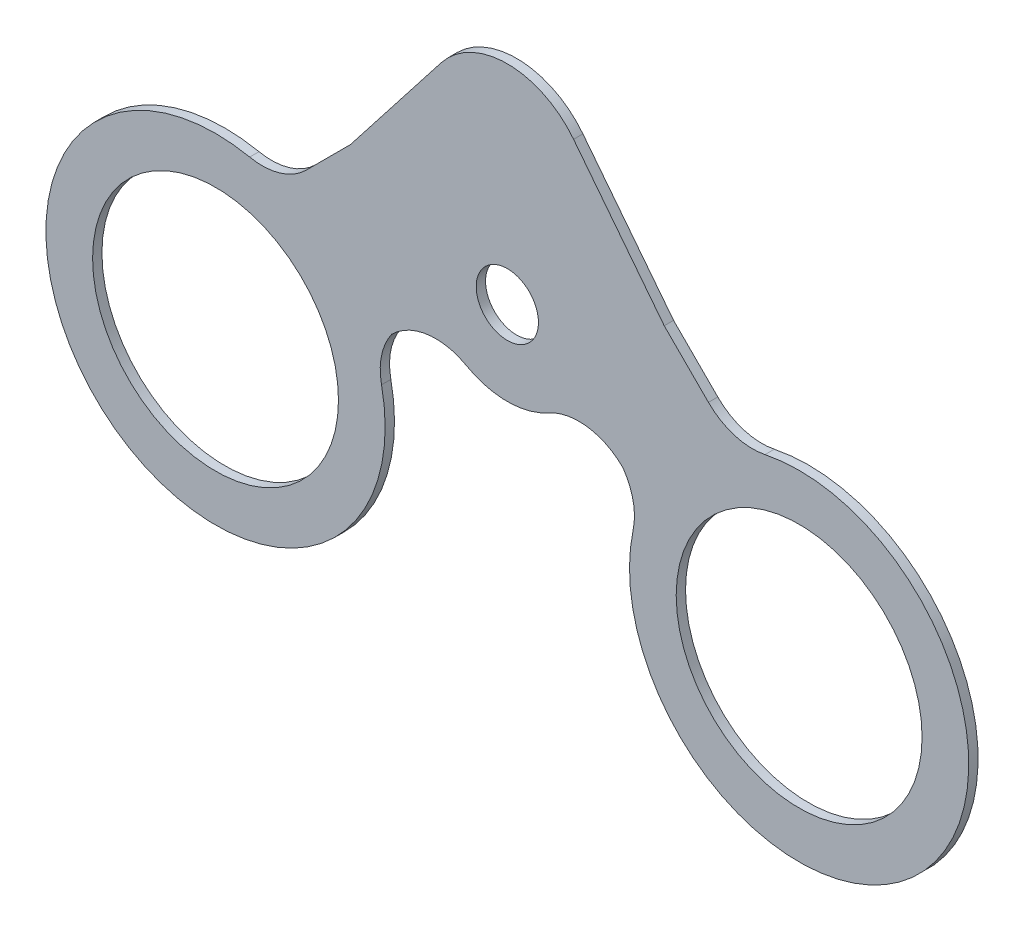
ISO-10303-21;
HEADER;
FILE_DESCRIPTION(('STEP AP214'),'2;1');
FILE_NAME('part.step','',(''),(''),'','','');
FILE_SCHEMA(('AUTOMOTIVE_DESIGN { 1 0 10303 214 1 1 1 1 }'));
ENDSEC;
DATA;
#1=APPLICATION_CONTEXT('core data for automotive mechanical design processes');
#2=APPLICATION_PROTOCOL_DEFINITION('international standard','automotive_design',2000,#1);
#3=PRODUCT_CONTEXT('',#1,'mechanical');
#4=PRODUCT('Part','Part','',(#3));
#5=PRODUCT_RELATED_PRODUCT_CATEGORY('part','',(#4));
#6=PRODUCT_DEFINITION_FORMATION('','',#4);
#7=PRODUCT_DEFINITION_CONTEXT('part definition',#1,'design');
#8=PRODUCT_DEFINITION('design','',#6,#7);
#9=PRODUCT_DEFINITION_SHAPE('','',#8);
#10=(LENGTH_UNIT() NAMED_UNIT(*) SI_UNIT(.MILLI.,.METRE.));
#11=(NAMED_UNIT(*) PLANE_ANGLE_UNIT() SI_UNIT($,.RADIAN.));
#12=(NAMED_UNIT(*) SI_UNIT($,.STERADIAN.) SOLID_ANGLE_UNIT());
#13=UNCERTAINTY_MEASURE_WITH_UNIT(LENGTH_MEASURE(1.E-05),#10,'distance_accuracy_value','');
#14=(GEOMETRIC_REPRESENTATION_CONTEXT(3) GLOBAL_UNCERTAINTY_ASSIGNED_CONTEXT((#13)) GLOBAL_UNIT_ASSIGNED_CONTEXT((#10,
#11,#12)) REPRESENTATION_CONTEXT('',''));
#15=CARTESIAN_POINT('',(0.,0.,0.));
#16=DIRECTION('',(0.,0.,1.));
#17=DIRECTION('',(1.,0.,0.));
#18=AXIS2_PLACEMENT_3D('',#15,#16,#17);
#19=CARTESIAN_POINT('',(-93.75,0.,3.));
#20=DIRECTION('',(0.,0.,1.));
#21=DIRECTION('',(1.,0.,0.));
#22=AXIS2_PLACEMENT_3D('',#19,#20,#21);
#23=PLANE('',#22);
#24=CARTESIAN_POINT('',(-93.75,0.,3.));
#25=DIRECTION('',(0.,0.,1.));
#26=DIRECTION('',(1.,0.,0.));
#27=AXIS2_PLACEMENT_3D('',#24,#25,#26);
#28=CIRCLE('',#27,39.5);
#29=CARTESIAN_POINT('',(-54.25,0.,3.));
#30=VERTEX_POINT('',#29);
#31=EDGE_CURVE('E282',#30,#30,#28,.T.);
#32=ORIENTED_EDGE('',*,*,#31,.F.);
#33=EDGE_LOOP('',(#32));
#34=FACE_BOUND('',#33,.T.);
#35=DIRECTION('',(-0.707106781186548,-0.707106781186547,0.));
#36=VECTOR('',#35,1.);
#37=CARTESIAN_POINT('',(-73.038609063629,50.4111920656595,3.));
#38=LINE('',#37,#36);
#39=CARTESIAN_POINT('',(-50.4111920656595,73.038609063629,3.));
#40=VERTEX_POINT('',#39);
#41=CARTESIAN_POINT('',(-64.6159621592224,58.8338389700661,3.));
#42=VERTEX_POINT('',#41);
#43=EDGE_CURVE('E170',#40,#42,#38,.T.);
#44=ORIENTED_EDGE('',*,*,#43,.T.);
#45=CARTESIAN_POINT('',(-78.7580977829533,72.975974593797,3.));
#46=DIRECTION('',(0.,0.,1.));
#47=DIRECTION('',(1.,0.,0.));
#48=AXIS2_PLACEMENT_3D('',#45,#46,#47);
#49=CIRCLE('',#48,20.);
#50=CARTESIAN_POINT('',(-82.7827695190733,53.3851089310327,3.));
#51=VERTEX_POINT('',#50);
#52=EDGE_CURVE('E235',#42,#51,#49,.F.);
#53=ORIENTED_EDGE('',*,*,#52,.T.);
#54=CARTESIAN_POINT('',(-93.75,0.,3.));
#55=DIRECTION('',(0.,0.,1.));
#56=DIRECTION('',(1.,0.,0.));
#57=AXIS2_PLACEMENT_3D('',#54,#55,#56);
#58=CIRCLE('',#57,54.5);
#59=CARTESIAN_POINT('',(-40.4147300473612,11.2070950330203,3.));
#60=VERTEX_POINT('',#59);
#61=EDGE_CURVE('E192',#51,#60,#58,.T.);
#62=ORIENTED_EDGE('',*,*,#61,.T.);
#63=CARTESIAN_POINT('',(-20.8421539179525,15.3197904579819,3.));
#64=DIRECTION('',(0.,0.,1.));
#65=DIRECTION('',(1.,0.,0.));
#66=AXIS2_PLACEMENT_3D('',#63,#64,#65);
#67=CIRCLE('',#66,20.);
#68=CARTESIAN_POINT('',(-37.1445252809144,26.9056735897971,3.));
#69=VERTEX_POINT('',#68);
#70=EDGE_CURVE('E11',#60,#69,#67,.F.);
#71=ORIENTED_EDGE('',*,*,#70,.T.);
#72=CARTESIAN_POINT('',(-23.0023896571834,12.7635379660662,3.));
#73=DIRECTION('',(0.,0.,1.));
#74=DIRECTION('',(1.,0.,0.));
#75=AXIS2_PLACEMENT_3D('',#72,#73,#74);
#76=CIRCLE('',#75,20.);
#77=CARTESIAN_POINT('',(-13.214138739233,30.2045856400806,3.));
#78=VERTEX_POINT('',#77);
#79=EDGE_CURVE('E216',#69,#78,#76,.F.);
#80=ORIENTED_EDGE('',*,*,#79,.T.);
#81=CARTESIAN_POINT('',(0.,53.75,3.));
#82=DIRECTION('',(0.,0.,1.));
#83=DIRECTION('',(1.,0.,0.));
#84=AXIS2_PLACEMENT_3D('',#81,#82,#83);
#85=CIRCLE('',#84,27.);
#86=CARTESIAN_POINT('',(13.214138739233,30.2045856400806,3.));
#87=VERTEX_POINT('',#86);
#88=EDGE_CURVE('E261',#78,#87,#85,.T.);
#89=ORIENTED_EDGE('',*,*,#88,.T.);
#90=CARTESIAN_POINT('',(23.0023896571834,12.7635379660661,3.));
#91=DIRECTION('',(0.,0.,1.));
#92=DIRECTION('',(1.,0.,0.));
#93=AXIS2_PLACEMENT_3D('',#90,#91,#92);
#94=CIRCLE('',#93,20.);
#95=CARTESIAN_POINT('',(37.1445252809143,26.9056735897971,3.));
#96=VERTEX_POINT('',#95);
#97=EDGE_CURVE('E211',#87,#96,#94,.F.);
#98=ORIENTED_EDGE('',*,*,#97,.T.);
#99=CARTESIAN_POINT('',(20.8421539179525,15.3197904579818,3.));
#100=DIRECTION('',(0.,0.,1.));
#101=DIRECTION('',(1.,0.,0.));
#102=AXIS2_PLACEMENT_3D('',#99,#100,#101);
#103=CIRCLE('',#102,20.);
#104=CARTESIAN_POINT('',(40.4147300473612,11.2070950330202,3.));
#105=VERTEX_POINT('',#104);
#106=EDGE_CURVE('E239',#96,#105,#103,.F.);
#107=ORIENTED_EDGE('',*,*,#106,.T.);
#108=CARTESIAN_POINT('',(93.75,0.,3.));
#109=DIRECTION('',(0.,0.,1.));
#110=DIRECTION('',(1.,0.,0.));
#111=AXIS2_PLACEMENT_3D('',#108,#109,#110);
#112=CIRCLE('',#111,54.5);
#113=CARTESIAN_POINT('',(82.7827695190733,53.3851089310328,3.));
#114=VERTEX_POINT('',#113);
#115=EDGE_CURVE('E148',#105,#114,#112,.T.);
#116=ORIENTED_EDGE('',*,*,#115,.T.);
#117=CARTESIAN_POINT('',(78.7580977829534,72.9759745937971,3.));
#118=DIRECTION('',(0.,0.,1.));
#119=DIRECTION('',(1.,0.,0.));
#120=AXIS2_PLACEMENT_3D('',#117,#118,#119);
#121=CIRCLE('',#120,20.);
#122=CARTESIAN_POINT('',(64.6159621592224,58.8338389700661,3.));
#123=VERTEX_POINT('',#122);
#124=EDGE_CURVE('E144',#114,#123,#121,.F.);
#125=ORIENTED_EDGE('',*,*,#124,.T.);
#126=DIRECTION('',(-0.707106781186548,0.707106781186547,0.));
#127=VECTOR('',#126,1.);
#128=CARTESIAN_POINT('',(73.038609063629,50.4111920656595,3.));
#129=LINE('',#128,#127);
#130=CARTESIAN_POINT('',(50.4111920656595,73.038609063629,3.));
#131=VERTEX_POINT('',#130);
#132=EDGE_CURVE('E136',#123,#131,#129,.T.);
#133=ORIENTED_EDGE('',*,*,#132,.T.);
#134=DIRECTION('',(-0.615217955531509,0.788357068333652,0.));
#135=VECTOR('',#134,1.);
#136=CARTESIAN_POINT('',(50.4111920656595,73.038609063629,3.));
#137=LINE('',#136,#135);
#138=CARTESIAN_POINT('',(21.2856408450086,110.360884799351,3.));
#139=VERTEX_POINT('',#138);
#140=EDGE_CURVE('E140',#131,#139,#137,.T.);
#141=ORIENTED_EDGE('',*,*,#140,.T.);
#142=CARTESIAN_POINT('',(0.,93.75,3.));
#143=DIRECTION('',(0.,0.,1.));
#144=DIRECTION('',(1.,0.,0.));
#145=AXIS2_PLACEMENT_3D('',#142,#143,#144);
#146=CIRCLE('',#145,27.);
#147=CARTESIAN_POINT('',(-21.2856408450086,110.360884799351,3.));
#148=VERTEX_POINT('',#147);
#149=EDGE_CURVE('E163',#139,#148,#146,.T.);
#150=ORIENTED_EDGE('',*,*,#149,.T.);
#151=DIRECTION('',(-0.615217955531509,-0.788357068333652,0.));
#152=VECTOR('',#151,1.);
#153=CARTESIAN_POINT('',(-50.4111920656595,73.038609063629,3.));
#154=LINE('',#153,#152);
#155=EDGE_CURVE('E165',#148,#40,#154,.T.);
#156=ORIENTED_EDGE('',*,*,#155,.T.);
#157=EDGE_LOOP('',(#44,#53,#62,#71,#80,#89,#98,#107,#116,#125,#133,#141,#150,#156));
#158=FACE_BOUND('',#157,.T.);
#159=CARTESIAN_POINT('',(93.75,0.,3.));
#160=DIRECTION('',(0.,0.,1.));
#161=DIRECTION('',(1.,0.,0.));
#162=AXIS2_PLACEMENT_3D('',#159,#160,#161);
#163=CIRCLE('',#162,39.5);
#164=CARTESIAN_POINT('',(133.25,0.,3.));
#165=VERTEX_POINT('',#164);
#166=EDGE_CURVE('E177',#165,#165,#163,.T.);
#167=ORIENTED_EDGE('',*,*,#166,.F.);
#168=EDGE_LOOP('',(#167));
#169=FACE_BOUND('',#168,.T.);
#170=CARTESIAN_POINT('',(0.,53.75,3.));
#171=DIRECTION('',(0.,0.,1.));
#172=DIRECTION('',(1.,0.,0.));
#173=AXIS2_PLACEMENT_3D('',#170,#171,#172);
#174=CIRCLE('',#173,10.);
#175=CARTESIAN_POINT('',(10.,53.75,3.));
#176=VERTEX_POINT('',#175);
#177=EDGE_CURVE('E288',#176,#176,#174,.T.);
#178=ORIENTED_EDGE('',*,*,#177,.F.);
#179=EDGE_LOOP('',(#178));
#180=FACE_BOUND('',#179,.T.);
#181=ADVANCED_FACE('F35',(#34,#158,#169,#180),#23,.T.);
#182=CARTESIAN_POINT('',(-93.75,0.,0.));
#183=DIRECTION('',(0.,0.,1.));
#184=DIRECTION('',(1.,0.,0.));
#185=AXIS2_PLACEMENT_3D('',#182,#183,#184);
#186=PLANE('',#185);
#187=CARTESIAN_POINT('',(-93.75,0.,0.));
#188=DIRECTION('',(0.,0.,1.));
#189=DIRECTION('',(1.,0.,0.));
#190=AXIS2_PLACEMENT_3D('',#187,#188,#189);
#191=CIRCLE('',#190,54.5);
#192=CARTESIAN_POINT('',(-82.7827695190733,53.3851089310327,0.));
#193=VERTEX_POINT('',#192);
#194=CARTESIAN_POINT('',(-40.4147300473612,11.2070950330203,0.));
#195=VERTEX_POINT('',#194);
#196=EDGE_CURVE('E173',#193,#195,#191,.T.);
#197=ORIENTED_EDGE('',*,*,#196,.F.);
#198=CARTESIAN_POINT('',(-78.7580977829533,72.975974593797,0.));
#199=DIRECTION('',(0.,0.,1.));
#200=DIRECTION('',(1.,0.,0.));
#201=AXIS2_PLACEMENT_3D('',#198,#199,#200);
#202=CIRCLE('',#201,20.);
#203=CARTESIAN_POINT('',(-64.6159621592224,58.8338389700661,0.));
#204=VERTEX_POINT('',#203);
#205=EDGE_CURVE('E58',#193,#204,#202,.T.);
#206=ORIENTED_EDGE('',*,*,#205,.T.);
#207=DIRECTION('',(-0.707106781186548,-0.707106781186547,0.));
#208=VECTOR('',#207,1.);
#209=CARTESIAN_POINT('',(-73.038609063629,50.4111920656595,0.));
#210=LINE('',#209,#208);
#211=CARTESIAN_POINT('',(-50.4111920656595,73.038609063629,0.));
#212=VERTEX_POINT('',#211);
#213=EDGE_CURVE('E190',#212,#204,#210,.T.);
#214=ORIENTED_EDGE('',*,*,#213,.F.);
#215=DIRECTION('',(-0.615217955531509,-0.788357068333652,0.));
#216=VECTOR('',#215,1.);
#217=CARTESIAN_POINT('',(-50.4111920656595,73.038609063629,0.));
#218=LINE('',#217,#216);
#219=CARTESIAN_POINT('',(-21.2856408450086,110.360884799351,0.));
#220=VERTEX_POINT('',#219);
#221=EDGE_CURVE('E188',#220,#212,#218,.T.);
#222=ORIENTED_EDGE('',*,*,#221,.F.);
#223=CARTESIAN_POINT('',(0.,93.75,0.));
#224=DIRECTION('',(0.,0.,1.));
#225=DIRECTION('',(1.,0.,0.));
#226=AXIS2_PLACEMENT_3D('',#223,#224,#225);
#227=CIRCLE('',#226,27.);
#228=CARTESIAN_POINT('',(21.2856408450086,110.360884799351,0.));
#229=VERTEX_POINT('',#228);
#230=EDGE_CURVE('E186',#229,#220,#227,.T.);
#231=ORIENTED_EDGE('',*,*,#230,.F.);
#232=DIRECTION('',(-0.615217955531509,0.788357068333652,0.));
#233=VECTOR('',#232,1.);
#234=CARTESIAN_POINT('',(50.4111920656595,73.038609063629,0.));
#235=LINE('',#234,#233);
#236=CARTESIAN_POINT('',(50.4111920656595,73.038609063629,0.));
#237=VERTEX_POINT('',#236);
#238=EDGE_CURVE('E184',#237,#229,#235,.T.);
#239=ORIENTED_EDGE('',*,*,#238,.F.);
#240=DIRECTION('',(-0.707106781186548,0.707106781186547,0.));
#241=VECTOR('',#240,1.);
#242=CARTESIAN_POINT('',(73.038609063629,50.4111920656595,0.));
#243=LINE('',#242,#241);
#244=CARTESIAN_POINT('',(64.6159621592224,58.8338389700661,0.));
#245=VERTEX_POINT('',#244);
#246=EDGE_CURVE('E154',#245,#237,#243,.T.);
#247=ORIENTED_EDGE('',*,*,#246,.F.);
#248=CARTESIAN_POINT('',(78.7580977829534,72.9759745937971,0.));
#249=DIRECTION('',(0.,0.,1.));
#250=DIRECTION('',(1.,0.,0.));
#251=AXIS2_PLACEMENT_3D('',#248,#249,#250);
#252=CIRCLE('',#251,20.);
#253=CARTESIAN_POINT('',(82.7827695190733,53.3851089310328,0.));
#254=VERTEX_POINT('',#253);
#255=EDGE_CURVE('E231',#245,#254,#252,.T.);
#256=ORIENTED_EDGE('',*,*,#255,.T.);
#257=CARTESIAN_POINT('',(93.75,0.,0.));
#258=DIRECTION('',(0.,0.,1.));
#259=DIRECTION('',(1.,0.,0.));
#260=AXIS2_PLACEMENT_3D('',#257,#258,#259);
#261=CIRCLE('',#260,54.5);
#262=CARTESIAN_POINT('',(40.4147300473612,11.2070950330202,0.));
#263=VERTEX_POINT('',#262);
#264=EDGE_CURVE('E180',#263,#254,#261,.T.);
#265=ORIENTED_EDGE('',*,*,#264,.F.);
#266=CARTESIAN_POINT('',(20.8421539179525,15.3197904579818,0.));
#267=DIRECTION('',(0.,0.,1.));
#268=DIRECTION('',(1.,0.,0.));
#269=AXIS2_PLACEMENT_3D('',#266,#267,#268);
#270=CIRCLE('',#269,20.);
#271=CARTESIAN_POINT('',(37.1445252809143,26.9056735897971,0.));
#272=VERTEX_POINT('',#271);
#273=EDGE_CURVE('E237',#263,#272,#270,.T.);
#274=ORIENTED_EDGE('',*,*,#273,.T.);
#275=CARTESIAN_POINT('',(23.0023896571834,12.7635379660661,0.));
#276=DIRECTION('',(0.,0.,1.));
#277=DIRECTION('',(1.,0.,0.));
#278=AXIS2_PLACEMENT_3D('',#275,#276,#277);
#279=CIRCLE('',#278,20.);
#280=CARTESIAN_POINT('',(13.214138739233,30.2045856400806,0.));
#281=VERTEX_POINT('',#280);
#282=EDGE_CURVE('E209',#272,#281,#279,.T.);
#283=ORIENTED_EDGE('',*,*,#282,.T.);
#284=CARTESIAN_POINT('',(0.,53.75,0.));
#285=DIRECTION('',(0.,0.,1.));
#286=DIRECTION('',(1.,0.,0.));
#287=AXIS2_PLACEMENT_3D('',#284,#285,#286);
#288=CIRCLE('',#287,27.);
#289=CARTESIAN_POINT('',(-13.214138739233,30.2045856400806,0.));
#290=VERTEX_POINT('',#289);
#291=EDGE_CURVE('E176',#290,#281,#288,.T.);
#292=ORIENTED_EDGE('',*,*,#291,.F.);
#293=CARTESIAN_POINT('',(-23.0023896571834,12.7635379660662,0.));
#294=DIRECTION('',(0.,0.,1.));
#295=DIRECTION('',(1.,0.,0.));
#296=AXIS2_PLACEMENT_3D('',#293,#294,#295);
#297=CIRCLE('',#296,20.);
#298=CARTESIAN_POINT('',(-37.1445252809144,26.9056735897971,0.));
#299=VERTEX_POINT('',#298);
#300=EDGE_CURVE('E213',#290,#299,#297,.T.);
#301=ORIENTED_EDGE('',*,*,#300,.T.);
#302=CARTESIAN_POINT('',(-20.8421539179525,15.3197904579819,0.));
#303=DIRECTION('',(0.,0.,1.));
#304=DIRECTION('',(1.,0.,0.));
#305=AXIS2_PLACEMENT_3D('',#302,#303,#304);
#306=CIRCLE('',#305,20.);
#307=EDGE_CURVE('E43',#299,#195,#306,.T.);
#308=ORIENTED_EDGE('',*,*,#307,.T.);
#309=EDGE_LOOP('',(#197,#206,#214,#222,#231,#239,#247,#256,#265,#274,#283,#292,#301,#308));
#310=FACE_BOUND('',#309,.T.);
#311=CARTESIAN_POINT('',(93.75,0.,0.));
#312=DIRECTION('',(0.,0.,1.));
#313=DIRECTION('',(1.,0.,0.));
#314=AXIS2_PLACEMENT_3D('',#311,#312,#313);
#315=CIRCLE('',#314,39.5);
#316=CARTESIAN_POINT('',(133.25,0.,0.));
#317=VERTEX_POINT('',#316);
#318=EDGE_CURVE('E279',#317,#317,#315,.T.);
#319=ORIENTED_EDGE('',*,*,#318,.T.);
#320=EDGE_LOOP('',(#319));
#321=FACE_BOUND('',#320,.T.);
#322=CARTESIAN_POINT('',(-93.75,0.,0.));
#323=DIRECTION('',(0.,0.,1.));
#324=DIRECTION('',(1.,0.,0.));
#325=AXIS2_PLACEMENT_3D('',#322,#323,#324);
#326=CIRCLE('',#325,39.5);
#327=CARTESIAN_POINT('',(-54.25,0.,0.));
#328=VERTEX_POINT('',#327);
#329=EDGE_CURVE('E285',#328,#328,#326,.T.);
#330=ORIENTED_EDGE('',*,*,#329,.T.);
#331=EDGE_LOOP('',(#330));
#332=FACE_BOUND('',#331,.T.);
#333=CARTESIAN_POINT('',(0.,53.75,0.));
#334=DIRECTION('',(0.,0.,1.));
#335=DIRECTION('',(1.,0.,0.));
#336=AXIS2_PLACEMENT_3D('',#333,#334,#335);
#337=CIRCLE('',#336,10.);
#338=CARTESIAN_POINT('',(10.,53.75,0.));
#339=VERTEX_POINT('',#338);
#340=EDGE_CURVE('E291',#339,#339,#337,.T.);
#341=ORIENTED_EDGE('',*,*,#340,.T.);
#342=EDGE_LOOP('',(#341));
#343=FACE_BOUND('',#342,.T.);
#344=ADVANCED_FACE('F240',(#310,#321,#332,#343),#186,.F.);
#345=CARTESIAN_POINT('',(-93.75,0.,3.));
#346=DIRECTION('',(0.,0.,-1.));
#347=DIRECTION('',(-1.,0.,0.));
#348=AXIS2_PLACEMENT_3D('',#345,#346,#347);
#349=CYLINDRICAL_SURFACE('',#348,54.5);
#350=ORIENTED_EDGE('',*,*,#61,.F.);
#351=DIRECTION('',(0.,0.,-1.));
#352=VECTOR('',#351,1.);
#353=CARTESIAN_POINT('',(-82.7827695190733,53.3851089310328,3.));
#354=LINE('',#353,#352);
#355=EDGE_CURVE('E227',#51,#193,#354,.T.);
#356=ORIENTED_EDGE('',*,*,#355,.T.);
#357=ORIENTED_EDGE('',*,*,#196,.T.);
#358=DIRECTION('',(0.,0.,-1.));
#359=VECTOR('',#358,1.);
#360=CARTESIAN_POINT('',(-40.4147300473612,11.2070950330203,3.));
#361=LINE('',#360,#359);
#362=EDGE_CURVE('E225',#195,#60,#361,.F.);
#363=ORIENTED_EDGE('',*,*,#362,.T.);
#364=EDGE_LOOP('',(#350,#356,#357,#363));
#365=FACE_BOUND('',#364,.T.);
#366=ADVANCED_FACE('F248',(#365),#349,.T.);
#367=CARTESIAN_POINT('',(0.,53.75,3.));
#368=DIRECTION('',(0.,0.,-1.));
#369=DIRECTION('',(-1.,0.,0.));
#370=AXIS2_PLACEMENT_3D('',#367,#368,#369);
#371=CYLINDRICAL_SURFACE('',#370,27.);
#372=ORIENTED_EDGE('',*,*,#291,.T.);
#373=DIRECTION('',(0.,0.,-1.));
#374=VECTOR('',#373,1.);
#375=CARTESIAN_POINT('',(13.214138739233,30.2045856400806,3.));
#376=LINE('',#375,#374);
#377=EDGE_CURVE('E204',#281,#87,#376,.F.);
#378=ORIENTED_EDGE('',*,*,#377,.T.);
#379=ORIENTED_EDGE('',*,*,#88,.F.);
#380=DIRECTION('',(0.,0.,-1.));
#381=VECTOR('',#380,1.);
#382=CARTESIAN_POINT('',(-13.214138739233,30.2045856400806,3.));
#383=LINE('',#382,#381);
#384=EDGE_CURVE('E201',#78,#290,#383,.T.);
#385=ORIENTED_EDGE('',*,*,#384,.T.);
#386=EDGE_LOOP('',(#372,#378,#379,#385));
#387=FACE_BOUND('',#386,.T.);
#388=ADVANCED_FACE('F259',(#387),#371,.T.);
#389=CARTESIAN_POINT('',(93.75,0.,3.));
#390=DIRECTION('',(0.,0.,-1.));
#391=DIRECTION('',(-1.,0.,0.));
#392=AXIS2_PLACEMENT_3D('',#389,#390,#391);
#393=CYLINDRICAL_SURFACE('',#392,54.5);
#394=ORIENTED_EDGE('',*,*,#264,.T.);
#395=DIRECTION('',(0.,0.,-1.));
#396=VECTOR('',#395,1.);
#397=CARTESIAN_POINT('',(82.7827695190733,53.3851089310328,3.));
#398=LINE('',#397,#396);
#399=EDGE_CURVE('E223',#254,#114,#398,.F.);
#400=ORIENTED_EDGE('',*,*,#399,.T.);
#401=ORIENTED_EDGE('',*,*,#115,.F.);
#402=DIRECTION('',(0.,0.,-1.));
#403=VECTOR('',#402,1.);
#404=CARTESIAN_POINT('',(40.4147300473612,11.2070950330202,3.));
#405=LINE('',#404,#403);
#406=EDGE_CURVE('E220',#105,#263,#405,.T.);
#407=ORIENTED_EDGE('',*,*,#406,.T.);
#408=EDGE_LOOP('',(#394,#400,#401,#407));
#409=FACE_BOUND('',#408,.T.);
#410=ADVANCED_FACE('F274',(#409),#393,.T.);
#411=CARTESIAN_POINT('',(73.038609063629,50.4111920656595,3.));
#412=DIRECTION('',(-0.707106781186547,-0.707106781186548,0.));
#413=DIRECTION('',(0.707106781186548,-0.707106781186547,0.));
#414=AXIS2_PLACEMENT_3D('',#411,#412,#413);
#415=PLANE('',#414);
#416=ORIENTED_EDGE('',*,*,#132,.F.);
#417=DIRECTION('',(0.,0.,1.));
#418=VECTOR('',#417,1.);
#419=CARTESIAN_POINT('',(64.6159621592224,58.8338389700661,0.));
#420=LINE('',#419,#418);
#421=EDGE_CURVE('E218',#123,#245,#420,.F.);
#422=ORIENTED_EDGE('',*,*,#421,.T.);
#423=ORIENTED_EDGE('',*,*,#246,.T.);
#424=DIRECTION('',(0.,0.,-1.));
#425=VECTOR('',#424,1.);
#426=CARTESIAN_POINT('',(50.4111920656595,73.038609063629,3.));
#427=LINE('',#426,#425);
#428=EDGE_CURVE('E151',#131,#237,#427,.T.);
#429=ORIENTED_EDGE('',*,*,#428,.F.);
#430=EDGE_LOOP('',(#416,#422,#423,#429));
#431=FACE_BOUND('',#430,.T.);
#432=ADVANCED_FACE('F152',(#431),#415,.F.);
#433=CARTESIAN_POINT('',(50.4111920656595,73.038609063629,3.));
#434=DIRECTION('',(-0.788357068333652,-0.615217955531509,0.));
#435=DIRECTION('',(0.615217955531509,-0.788357068333652,0.));
#436=AXIS2_PLACEMENT_3D('',#433,#434,#435);
#437=PLANE('',#436);
#438=ORIENTED_EDGE('',*,*,#238,.T.);
#439=DIRECTION('',(0.,0.,-1.));
#440=VECTOR('',#439,1.);
#441=CARTESIAN_POINT('',(21.2856408450086,110.360884799351,3.));
#442=LINE('',#441,#440);
#443=EDGE_CURVE('E158',#139,#229,#442,.T.);
#444=ORIENTED_EDGE('',*,*,#443,.F.);
#445=ORIENTED_EDGE('',*,*,#140,.F.);
#446=ORIENTED_EDGE('',*,*,#428,.T.);
#447=EDGE_LOOP('',(#438,#444,#445,#446));
#448=FACE_BOUND('',#447,.T.);
#449=ADVANCED_FACE('F160',(#448),#437,.F.);
#450=CARTESIAN_POINT('',(0.,93.75,3.));
#451=DIRECTION('',(0.,0.,-1.));
#452=DIRECTION('',(-1.,0.,0.));
#453=AXIS2_PLACEMENT_3D('',#450,#451,#452);
#454=CYLINDRICAL_SURFACE('',#453,27.);
#455=ORIENTED_EDGE('',*,*,#230,.T.);
#456=DIRECTION('',(0.,0.,-1.));
#457=VECTOR('',#456,1.);
#458=CARTESIAN_POINT('',(-21.2856408450086,110.360884799351,3.));
#459=LINE('',#458,#457);
#460=EDGE_CURVE('E195',#148,#220,#459,.T.);
#461=ORIENTED_EDGE('',*,*,#460,.F.);
#462=ORIENTED_EDGE('',*,*,#149,.F.);
#463=ORIENTED_EDGE('',*,*,#443,.T.);
#464=EDGE_LOOP('',(#455,#461,#462,#463));
#465=FACE_BOUND('',#464,.T.);
#466=ADVANCED_FACE('F319',(#465),#454,.T.);
#467=CARTESIAN_POINT('',(-50.4111920656595,73.038609063629,3.));
#468=DIRECTION('',(0.788357068333652,-0.615217955531508,0.));
#469=DIRECTION('',(0.615217955531509,0.788357068333652,0.));
#470=AXIS2_PLACEMENT_3D('',#467,#468,#469);
#471=PLANE('',#470);
#472=ORIENTED_EDGE('',*,*,#221,.T.);
#473=DIRECTION('',(0.,0.,-1.));
#474=VECTOR('',#473,1.);
#475=CARTESIAN_POINT('',(-50.4111920656595,73.038609063629,3.));
#476=LINE('',#475,#474);
#477=EDGE_CURVE('E172',#40,#212,#476,.T.);
#478=ORIENTED_EDGE('',*,*,#477,.F.);
#479=ORIENTED_EDGE('',*,*,#155,.F.);
#480=ORIENTED_EDGE('',*,*,#460,.T.);
#481=EDGE_LOOP('',(#472,#478,#479,#480));
#482=FACE_BOUND('',#481,.T.);
#483=ADVANCED_FACE('F316',(#482),#471,.F.);
#484=CARTESIAN_POINT('',(-73.038609063629,50.4111920656595,3.));
#485=DIRECTION('',(0.707106781186547,-0.707106781186548,0.));
#486=DIRECTION('',(0.707106781186548,0.707106781186547,0.));
#487=AXIS2_PLACEMENT_3D('',#484,#485,#486);
#488=PLANE('',#487);
#489=ORIENTED_EDGE('',*,*,#213,.T.);
#490=DIRECTION('',(0.,0.,1.));
#491=VECTOR('',#490,1.);
#492=CARTESIAN_POINT('',(-64.6159621592224,58.8338389700661,3.));
#493=LINE('',#492,#491);
#494=EDGE_CURVE('E50',#204,#42,#493,.T.);
#495=ORIENTED_EDGE('',*,*,#494,.T.);
#496=ORIENTED_EDGE('',*,*,#43,.F.);
#497=ORIENTED_EDGE('',*,*,#477,.T.);
#498=EDGE_LOOP('',(#489,#495,#496,#497));
#499=FACE_BOUND('',#498,.T.);
#500=ADVANCED_FACE('F313',(#499),#488,.F.);
#501=CARTESIAN_POINT('',(93.75,0.,3.));
#502=DIRECTION('',(0.,0.,-1.));
#503=DIRECTION('',(-1.,0.,0.));
#504=AXIS2_PLACEMENT_3D('',#501,#502,#503);
#505=CYLINDRICAL_SURFACE('',#504,39.5);
#506=ORIENTED_EDGE('',*,*,#166,.T.);
#507=EDGE_LOOP('',(#506));
#508=FACE_BOUND('',#507,.T.);
#509=ORIENTED_EDGE('',*,*,#318,.F.);
#510=EDGE_LOOP('',(#509));
#511=FACE_BOUND('',#510,.T.);
#512=ADVANCED_FACE('F310',(#508,#511),#505,.F.);
#513=CARTESIAN_POINT('',(-93.75,0.,3.));
#514=DIRECTION('',(0.,0.,-1.));
#515=DIRECTION('',(-1.,0.,0.));
#516=AXIS2_PLACEMENT_3D('',#513,#514,#515);
#517=CYLINDRICAL_SURFACE('',#516,39.5);
#518=ORIENTED_EDGE('',*,*,#31,.T.);
#519=EDGE_LOOP('',(#518));
#520=FACE_BOUND('',#519,.T.);
#521=ORIENTED_EDGE('',*,*,#329,.F.);
#522=EDGE_LOOP('',(#521));
#523=FACE_BOUND('',#522,.T.);
#524=ADVANCED_FACE('F444',(#520,#523),#517,.F.);
#525=CARTESIAN_POINT('',(0.,53.75,3.));
#526=DIRECTION('',(0.,0.,-1.));
#527=DIRECTION('',(-1.,0.,0.));
#528=AXIS2_PLACEMENT_3D('',#525,#526,#527);
#529=CYLINDRICAL_SURFACE('',#528,10.);
#530=ORIENTED_EDGE('',*,*,#177,.T.);
#531=EDGE_LOOP('',(#530));
#532=FACE_BOUND('',#531,.T.);
#533=ORIENTED_EDGE('',*,*,#340,.F.);
#534=EDGE_LOOP('',(#533));
#535=FACE_BOUND('',#534,.T.);
#536=ADVANCED_FACE('F297',(#532,#535),#529,.F.);
#537=CARTESIAN_POINT('',(23.0023896571834,12.7635379660661,3.));
#538=DIRECTION('',(0.,0.,-1.));
#539=DIRECTION('',(-1.,0.,0.));
#540=AXIS2_PLACEMENT_3D('',#537,#538,#539);
#541=CYLINDRICAL_SURFACE('',#540,20.);
#542=ORIENTED_EDGE('',*,*,#97,.F.);
#543=ORIENTED_EDGE('',*,*,#377,.F.);
#544=ORIENTED_EDGE('',*,*,#282,.F.);
#545=DIRECTION('',(0.,0.,1.));
#546=VECTOR('',#545,1.);
#547=CARTESIAN_POINT('',(37.1445252809143,26.9056735897971,0.));
#548=LINE('',#547,#546);
#549=EDGE_CURVE('E157',#96,#272,#548,.F.);
#550=ORIENTED_EDGE('',*,*,#549,.F.);
#551=EDGE_LOOP('',(#542,#543,#544,#550));
#552=FACE_BOUND('',#551,.T.);
#553=ADVANCED_FACE('F267',(#552),#541,.F.);
#554=CARTESIAN_POINT('',(-23.0023896571834,12.7635379660662,3.));
#555=DIRECTION('',(0.,0.,-1.));
#556=DIRECTION('',(-1.,0.,0.));
#557=AXIS2_PLACEMENT_3D('',#554,#555,#556);
#558=CYLINDRICAL_SURFACE('',#557,20.);
#559=ORIENTED_EDGE('',*,*,#79,.F.);
#560=DIRECTION('',(0.,0.,1.));
#561=VECTOR('',#560,1.);
#562=CARTESIAN_POINT('',(-37.1445252809144,26.9056735897971,3.));
#563=LINE('',#562,#561);
#564=EDGE_CURVE('E206',#299,#69,#563,.T.);
#565=ORIENTED_EDGE('',*,*,#564,.F.);
#566=ORIENTED_EDGE('',*,*,#300,.F.);
#567=ORIENTED_EDGE('',*,*,#384,.F.);
#568=EDGE_LOOP('',(#559,#565,#566,#567));
#569=FACE_BOUND('',#568,.T.);
#570=ADVANCED_FACE('F257',(#569),#558,.F.);
#571=CARTESIAN_POINT('',(78.7580977829534,72.9759745937971,3.));
#572=DIRECTION('',(0.,0.,-1.));
#573=DIRECTION('',(-1.,0.,0.));
#574=AXIS2_PLACEMENT_3D('',#571,#572,#573);
#575=CYLINDRICAL_SURFACE('',#574,20.);
#576=ORIENTED_EDGE('',*,*,#124,.F.);
#577=ORIENTED_EDGE('',*,*,#399,.F.);
#578=ORIENTED_EDGE('',*,*,#255,.F.);
#579=ORIENTED_EDGE('',*,*,#421,.F.);
#580=EDGE_LOOP('',(#576,#577,#578,#579));
#581=FACE_BOUND('',#580,.T.);
#582=ADVANCED_FACE('F337',(#581),#575,.F.);
#583=CARTESIAN_POINT('',(-78.7580977829533,72.975974593797,3.));
#584=DIRECTION('',(0.,0.,-1.));
#585=DIRECTION('',(-1.,0.,0.));
#586=AXIS2_PLACEMENT_3D('',#583,#584,#585);
#587=CYLINDRICAL_SURFACE('',#586,20.);
#588=ORIENTED_EDGE('',*,*,#52,.F.);
#589=ORIENTED_EDGE('',*,*,#494,.F.);
#590=ORIENTED_EDGE('',*,*,#205,.F.);
#591=ORIENTED_EDGE('',*,*,#355,.F.);
#592=EDGE_LOOP('',(#588,#589,#590,#591));
#593=FACE_BOUND('',#592,.T.);
#594=ADVANCED_FACE('F340',(#593),#587,.F.);
#595=CARTESIAN_POINT('',(20.8421539179525,15.3197904579818,3.));
#596=DIRECTION('',(0.,0.,1.));
#597=DIRECTION('',(1.,0.,0.));
#598=AXIS2_PLACEMENT_3D('',#595,#596,#597);
#599=CYLINDRICAL_SURFACE('',#598,20.);
#600=ORIENTED_EDGE('',*,*,#106,.F.);
#601=ORIENTED_EDGE('',*,*,#549,.T.);
#602=ORIENTED_EDGE('',*,*,#273,.F.);
#603=ORIENTED_EDGE('',*,*,#406,.F.);
#604=EDGE_LOOP('',(#600,#601,#602,#603));
#605=FACE_BOUND('',#604,.T.);
#606=ADVANCED_FACE('F270',(#605),#599,.F.);
#607=CARTESIAN_POINT('',(-20.8421539179525,15.3197904579819,3.));
#608=DIRECTION('',(0.,0.,1.));
#609=DIRECTION('',(1.,0.,0.));
#610=AXIS2_PLACEMENT_3D('',#607,#608,#609);
#611=CYLINDRICAL_SURFACE('',#610,20.);
#612=ORIENTED_EDGE('',*,*,#70,.F.);
#613=ORIENTED_EDGE('',*,*,#362,.F.);
#614=ORIENTED_EDGE('',*,*,#307,.F.);
#615=ORIENTED_EDGE('',*,*,#564,.T.);
#616=EDGE_LOOP('',(#612,#613,#614,#615));
#617=FACE_BOUND('',#616,.T.);
#618=ADVANCED_FACE('F37',(#617),#611,.F.);
#619=CLOSED_SHELL('',(#181,#344,#366,#388,#410,#432,#449,#466,#483,#500,#512,#524,#536,#553,
#570,#582,#594,#606,#618));
#620=MANIFOLD_SOLID_BREP('B2',#619);
#621=ADVANCED_BREP_SHAPE_REPRESENTATION('',(#18,#620),#14);
#622=SHAPE_DEFINITION_REPRESENTATION(#9,#621);
ENDSEC;
END-ISO-10303-21;
